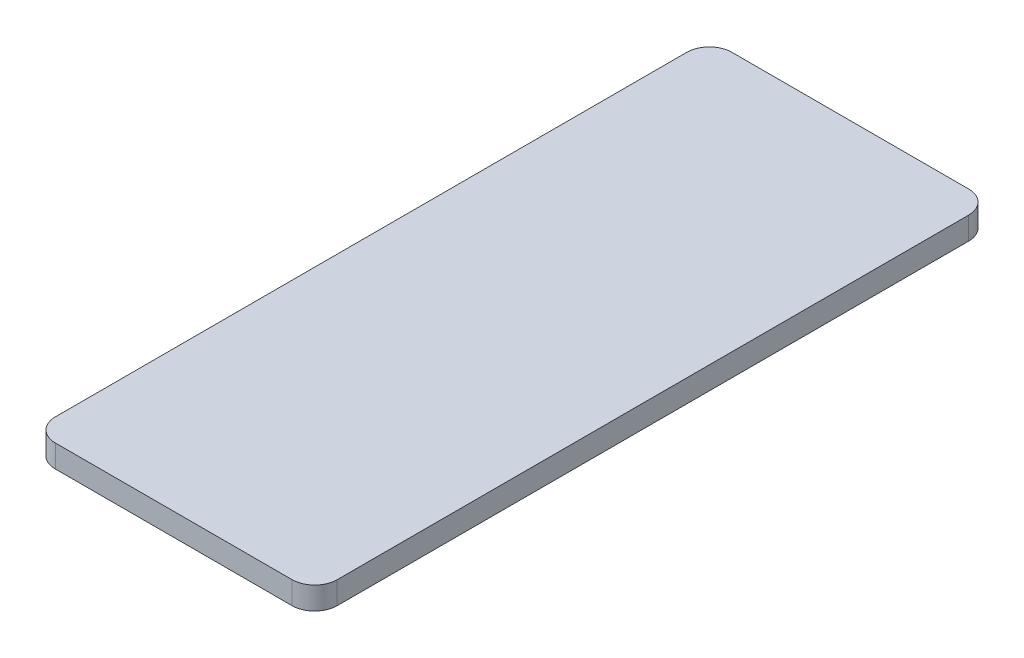
ISO-10303-21;
HEADER;
FILE_DESCRIPTION(('STEP AP214'),'2;1');
FILE_NAME('part.step','',(''),(''),'','','');
FILE_SCHEMA(('AUTOMOTIVE_DESIGN { 1 0 10303 214 1 1 1 1 }'));
ENDSEC;
DATA;
#1=APPLICATION_CONTEXT('core data for automotive mechanical design processes');
#2=APPLICATION_PROTOCOL_DEFINITION('international standard','automotive_design',2000,#1);
#3=PRODUCT_CONTEXT('',#1,'mechanical');
#4=PRODUCT('Part','Part','',(#3));
#5=PRODUCT_RELATED_PRODUCT_CATEGORY('part','',(#4));
#6=PRODUCT_DEFINITION_FORMATION('','',#4);
#7=PRODUCT_DEFINITION_CONTEXT('part definition',#1,'design');
#8=PRODUCT_DEFINITION('design','',#6,#7);
#9=PRODUCT_DEFINITION_SHAPE('','',#8);
#10=(LENGTH_UNIT() NAMED_UNIT(*) SI_UNIT(.MILLI.,.METRE.));
#11=(NAMED_UNIT(*) PLANE_ANGLE_UNIT() SI_UNIT($,.RADIAN.));
#12=(NAMED_UNIT(*) SI_UNIT($,.STERADIAN.) SOLID_ANGLE_UNIT());
#13=UNCERTAINTY_MEASURE_WITH_UNIT(LENGTH_MEASURE(1.E-05),#10,'distance_accuracy_value','');
#14=(GEOMETRIC_REPRESENTATION_CONTEXT(3) GLOBAL_UNCERTAINTY_ASSIGNED_CONTEXT((#13)) GLOBAL_UNIT_ASSIGNED_CONTEXT((#10,
#11,#12)) REPRESENTATION_CONTEXT('',''));
#15=CARTESIAN_POINT('',(0.,0.,0.));
#16=DIRECTION('',(0.,0.,1.));
#17=DIRECTION('',(1.,0.,0.));
#18=AXIS2_PLACEMENT_3D('',#15,#16,#17);
#19=CARTESIAN_POINT('',(-12.5,2.,30.));
#20=DIRECTION('',(1.,0.,0.));
#21=DIRECTION('',(0.,0.,-1.));
#22=AXIS2_PLACEMENT_3D('',#19,#20,#21);
#23=PLANE('',#22);
#24=DIRECTION('',(0.,0.,1.));
#25=VECTOR('',#24,1.);
#26=CARTESIAN_POINT('',(-12.5,0.,30.));
#27=LINE('',#26,#25);
#28=CARTESIAN_POINT('',(-12.5,0.,-28.));
#29=VERTEX_POINT('',#28);
#30=CARTESIAN_POINT('',(-12.5,0.,28.));
#31=VERTEX_POINT('',#30);
#32=EDGE_CURVE('E136',#29,#31,#27,.T.);
#33=ORIENTED_EDGE('',*,*,#32,.T.);
#34=DIRECTION('',(0.,-1.,0.));
#35=VECTOR('',#34,1.);
#36=CARTESIAN_POINT('',(-12.5,2.,28.));
#37=LINE('',#36,#35);
#38=CARTESIAN_POINT('',(-12.5,2.,28.));
#39=VERTEX_POINT('',#38);
#40=EDGE_CURVE('E111',#31,#39,#37,.F.);
#41=ORIENTED_EDGE('',*,*,#40,.T.);
#42=DIRECTION('',(0.,0.,1.));
#43=VECTOR('',#42,1.);
#44=CARTESIAN_POINT('',(-12.5,2.,30.));
#45=LINE('',#44,#43);
#46=CARTESIAN_POINT('',(-12.5,2.,-28.));
#47=VERTEX_POINT('',#46);
#48=EDGE_CURVE('E148',#47,#39,#45,.T.);
#49=ORIENTED_EDGE('',*,*,#48,.F.);
#50=DIRECTION('',(0.,-1.,0.));
#51=VECTOR('',#50,1.);
#52=CARTESIAN_POINT('',(-12.5,2.,-28.));
#53=LINE('',#52,#51);
#54=EDGE_CURVE('E117',#47,#29,#53,.T.);
#55=ORIENTED_EDGE('',*,*,#54,.T.);
#56=EDGE_LOOP('',(#33,#41,#49,#55));
#57=FACE_BOUND('',#56,.T.);
#58=ADVANCED_FACE('F39',(#57),#23,.F.);
#59=CARTESIAN_POINT('',(12.5,2.,30.));
#60=DIRECTION('',(0.,0.,-1.));
#61=DIRECTION('',(-1.,0.,0.));
#62=AXIS2_PLACEMENT_3D('',#59,#60,#61);
#63=PLANE('',#62);
#64=DIRECTION('',(1.,0.,0.));
#65=VECTOR('',#64,1.);
#66=CARTESIAN_POINT('',(12.5,2.,30.));
#67=LINE('',#66,#65);
#68=CARTESIAN_POINT('',(-10.5,2.,30.));
#69=VERTEX_POINT('',#68);
#70=CARTESIAN_POINT('',(10.5,2.,30.));
#71=VERTEX_POINT('',#70);
#72=EDGE_CURVE('E127',#69,#71,#67,.T.);
#73=ORIENTED_EDGE('',*,*,#72,.F.);
#74=DIRECTION('',(0.,-1.,0.));
#75=VECTOR('',#74,1.);
#76=CARTESIAN_POINT('',(-10.5,2.,30.));
#77=LINE('',#76,#75);
#78=CARTESIAN_POINT('',(-10.5,0.,30.));
#79=VERTEX_POINT('',#78);
#80=EDGE_CURVE('E110',#69,#79,#77,.T.);
#81=ORIENTED_EDGE('',*,*,#80,.T.);
#82=DIRECTION('',(1.,0.,0.));
#83=VECTOR('',#82,1.);
#84=CARTESIAN_POINT('',(12.5,0.,30.));
#85=LINE('',#84,#83);
#86=CARTESIAN_POINT('',(10.5,0.,30.));
#87=VERTEX_POINT('',#86);
#88=EDGE_CURVE('E124',#79,#87,#85,.T.);
#89=ORIENTED_EDGE('',*,*,#88,.T.);
#90=DIRECTION('',(0.,-1.,0.));
#91=VECTOR('',#90,1.);
#92=CARTESIAN_POINT('',(10.5,2.,30.));
#93=LINE('',#92,#91);
#94=EDGE_CURVE('E130',#87,#71,#93,.F.);
#95=ORIENTED_EDGE('',*,*,#94,.T.);
#96=EDGE_LOOP('',(#73,#81,#89,#95));
#97=FACE_BOUND('',#96,.T.);
#98=ADVANCED_FACE('F123',(#97),#63,.F.);
#99=CARTESIAN_POINT('',(12.5,2.,30.));
#100=DIRECTION('',(-1.,0.,0.));
#101=DIRECTION('',(0.,0.,1.));
#102=AXIS2_PLACEMENT_3D('',#99,#100,#101);
#103=PLANE('',#102);
#104=DIRECTION('',(0.,0.,-1.));
#105=VECTOR('',#104,1.);
#106=CARTESIAN_POINT('',(12.5,0.,30.));
#107=LINE('',#106,#105);
#108=CARTESIAN_POINT('',(12.5,0.,28.));
#109=VERTEX_POINT('',#108);
#110=CARTESIAN_POINT('',(12.5,0.,-28.));
#111=VERTEX_POINT('',#110);
#112=EDGE_CURVE('E135',#109,#111,#107,.T.);
#113=ORIENTED_EDGE('',*,*,#112,.T.);
#114=DIRECTION('',(0.,-1.,0.));
#115=VECTOR('',#114,1.);
#116=CARTESIAN_POINT('',(12.5,2.,-28.));
#117=LINE('',#116,#115);
#118=CARTESIAN_POINT('',(12.5,2.,-28.));
#119=VERTEX_POINT('',#118);
#120=EDGE_CURVE('E11',#111,#119,#117,.F.);
#121=ORIENTED_EDGE('',*,*,#120,.T.);
#122=DIRECTION('',(0.,0.,-1.));
#123=VECTOR('',#122,1.);
#124=CARTESIAN_POINT('',(12.5,2.,30.));
#125=LINE('',#124,#123);
#126=CARTESIAN_POINT('',(12.5,2.,28.));
#127=VERTEX_POINT('',#126);
#128=EDGE_CURVE('E187',#127,#119,#125,.T.);
#129=ORIENTED_EDGE('',*,*,#128,.F.);
#130=DIRECTION('',(0.,-1.,0.));
#131=VECTOR('',#130,1.);
#132=CARTESIAN_POINT('',(12.5,2.,28.));
#133=LINE('',#132,#131);
#134=EDGE_CURVE('E48',#127,#109,#133,.T.);
#135=ORIENTED_EDGE('',*,*,#134,.T.);
#136=EDGE_LOOP('',(#113,#121,#129,#135));
#137=FACE_BOUND('',#136,.T.);
#138=ADVANCED_FACE('F185',(#137),#103,.F.);
#139=CARTESIAN_POINT('',(12.5,2.,-30.));
#140=DIRECTION('',(0.,0.,1.));
#141=DIRECTION('',(1.,0.,0.));
#142=AXIS2_PLACEMENT_3D('',#139,#140,#141);
#143=PLANE('',#142);
#144=DIRECTION('',(-1.,0.,0.));
#145=VECTOR('',#144,1.);
#146=CARTESIAN_POINT('',(12.5,0.,-30.));
#147=LINE('',#146,#145);
#148=CARTESIAN_POINT('',(10.5,0.,-30.));
#149=VERTEX_POINT('',#148);
#150=CARTESIAN_POINT('',(-10.5,0.,-30.));
#151=VERTEX_POINT('',#150);
#152=EDGE_CURVE('E141',#149,#151,#147,.T.);
#153=ORIENTED_EDGE('',*,*,#152,.T.);
#154=DIRECTION('',(0.,-1.,0.));
#155=VECTOR('',#154,1.);
#156=CARTESIAN_POINT('',(-10.5,2.,-30.));
#157=LINE('',#156,#155);
#158=CARTESIAN_POINT('',(-10.5,2.,-30.));
#159=VERTEX_POINT('',#158);
#160=EDGE_CURVE('E55',#151,#159,#157,.F.);
#161=ORIENTED_EDGE('',*,*,#160,.T.);
#162=DIRECTION('',(-1.,0.,0.));
#163=VECTOR('',#162,1.);
#164=CARTESIAN_POINT('',(12.5,2.,-30.));
#165=LINE('',#164,#163);
#166=CARTESIAN_POINT('',(10.5,2.,-30.));
#167=VERTEX_POINT('',#166);
#168=EDGE_CURVE('E150',#167,#159,#165,.T.);
#169=ORIENTED_EDGE('',*,*,#168,.F.);
#170=DIRECTION('',(0.,-1.,0.));
#171=VECTOR('',#170,1.);
#172=CARTESIAN_POINT('',(10.5,2.,-30.));
#173=LINE('',#172,#171);
#174=EDGE_CURVE('E175',#167,#149,#173,.T.);
#175=ORIENTED_EDGE('',*,*,#174,.T.);
#176=EDGE_LOOP('',(#153,#161,#169,#175));
#177=FACE_BOUND('',#176,.T.);
#178=ADVANCED_FACE('F194',(#177),#143,.F.);
#179=CARTESIAN_POINT('',(0.,2.,0.));
#180=DIRECTION('',(0.,1.,0.));
#181=DIRECTION('',(0.,0.,1.));
#182=AXIS2_PLACEMENT_3D('',#179,#180,#181);
#183=PLANE('',#182);
#184=ORIENTED_EDGE('',*,*,#48,.T.);
#185=CARTESIAN_POINT('',(-10.5,2.,28.));
#186=DIRECTION('',(0.,1.,0.));
#187=DIRECTION('',(0.,0.,1.));
#188=AXIS2_PLACEMENT_3D('',#185,#186,#187);
#189=CIRCLE('',#188,2.);
#190=EDGE_CURVE('E172',#39,#69,#189,.T.);
#191=ORIENTED_EDGE('',*,*,#190,.T.);
#192=ORIENTED_EDGE('',*,*,#72,.T.);
#193=CARTESIAN_POINT('',(10.5,2.,28.));
#194=DIRECTION('',(0.,1.,0.));
#195=DIRECTION('',(0.,0.,1.));
#196=AXIS2_PLACEMENT_3D('',#193,#194,#195);
#197=CIRCLE('',#196,2.);
#198=EDGE_CURVE('E164',#71,#127,#197,.T.);
#199=ORIENTED_EDGE('',*,*,#198,.T.);
#200=ORIENTED_EDGE('',*,*,#128,.T.);
#201=CARTESIAN_POINT('',(10.5,2.,-28.));
#202=DIRECTION('',(0.,1.,0.));
#203=DIRECTION('',(0.,0.,1.));
#204=AXIS2_PLACEMENT_3D('',#201,#202,#203);
#205=CIRCLE('',#204,2.);
#206=EDGE_CURVE('E62',#119,#167,#205,.T.);
#207=ORIENTED_EDGE('',*,*,#206,.T.);
#208=ORIENTED_EDGE('',*,*,#168,.T.);
#209=CARTESIAN_POINT('',(-10.5,2.,-28.));
#210=DIRECTION('',(0.,1.,0.));
#211=DIRECTION('',(0.,0.,1.));
#212=AXIS2_PLACEMENT_3D('',#209,#210,#211);
#213=CIRCLE('',#212,2.);
#214=EDGE_CURVE('E169',#159,#47,#213,.T.);
#215=ORIENTED_EDGE('',*,*,#214,.T.);
#216=EDGE_LOOP('',(#184,#191,#192,#199,#200,#207,#208,#215));
#217=FACE_BOUND('',#216,.T.);
#218=ADVANCED_FACE('F205',(#217),#183,.T.);
#219=CARTESIAN_POINT('',(0.,0.,0.));
#220=DIRECTION('',(0.,1.,0.));
#221=DIRECTION('',(0.,0.,1.));
#222=AXIS2_PLACEMENT_3D('',#219,#220,#221);
#223=PLANE('',#222);
#224=ORIENTED_EDGE('',*,*,#88,.F.);
#225=CARTESIAN_POINT('',(-10.5,0.,28.));
#226=DIRECTION('',(0.,1.,0.));
#227=DIRECTION('',(0.,0.,1.));
#228=AXIS2_PLACEMENT_3D('',#225,#226,#227);
#229=CIRCLE('',#228,2.);
#230=EDGE_CURVE('E106',#79,#31,#229,.F.);
#231=ORIENTED_EDGE('',*,*,#230,.T.);
#232=ORIENTED_EDGE('',*,*,#32,.F.);
#233=CARTESIAN_POINT('',(-10.5,0.,-28.));
#234=DIRECTION('',(0.,1.,0.));
#235=DIRECTION('',(0.,0.,1.));
#236=AXIS2_PLACEMENT_3D('',#233,#234,#235);
#237=CIRCLE('',#236,2.);
#238=EDGE_CURVE('E118',#29,#151,#237,.F.);
#239=ORIENTED_EDGE('',*,*,#238,.T.);
#240=ORIENTED_EDGE('',*,*,#152,.F.);
#241=CARTESIAN_POINT('',(10.5,0.,-28.));
#242=DIRECTION('',(0.,1.,0.));
#243=DIRECTION('',(0.,0.,1.));
#244=AXIS2_PLACEMENT_3D('',#241,#242,#243);
#245=CIRCLE('',#244,2.);
#246=EDGE_CURVE('E154',#149,#111,#245,.F.);
#247=ORIENTED_EDGE('',*,*,#246,.T.);
#248=ORIENTED_EDGE('',*,*,#112,.F.);
#249=CARTESIAN_POINT('',(10.5,0.,28.));
#250=DIRECTION('',(0.,1.,0.));
#251=DIRECTION('',(0.,0.,1.));
#252=AXIS2_PLACEMENT_3D('',#249,#250,#251);
#253=CIRCLE('',#252,2.);
#254=EDGE_CURVE('E129',#109,#87,#253,.F.);
#255=ORIENTED_EDGE('',*,*,#254,.T.);
#256=EDGE_LOOP('',(#224,#231,#232,#239,#240,#247,#248,#255));
#257=FACE_BOUND('',#256,.T.);
#258=ADVANCED_FACE('F132',(#257),#223,.F.);
#259=CARTESIAN_POINT('',(-10.5,2.,28.));
#260=DIRECTION('',(0.,-1.,0.));
#261=DIRECTION('',(0.,0.,-1.));
#262=AXIS2_PLACEMENT_3D('',#259,#260,#261);
#263=CYLINDRICAL_SURFACE('',#262,2.);
#264=ORIENTED_EDGE('',*,*,#190,.F.);
#265=ORIENTED_EDGE('',*,*,#40,.F.);
#266=ORIENTED_EDGE('',*,*,#230,.F.);
#267=ORIENTED_EDGE('',*,*,#80,.F.);
#268=EDGE_LOOP('',(#264,#265,#266,#267));
#269=FACE_BOUND('',#268,.T.);
#270=ADVANCED_FACE('F109',(#269),#263,.T.);
#271=CARTESIAN_POINT('',(-10.5,2.,-28.));
#272=DIRECTION('',(0.,-1.,0.));
#273=DIRECTION('',(0.,0.,-1.));
#274=AXIS2_PLACEMENT_3D('',#271,#272,#273);
#275=CYLINDRICAL_SURFACE('',#274,2.);
#276=ORIENTED_EDGE('',*,*,#214,.F.);
#277=ORIENTED_EDGE('',*,*,#160,.F.);
#278=ORIENTED_EDGE('',*,*,#238,.F.);
#279=ORIENTED_EDGE('',*,*,#54,.F.);
#280=EDGE_LOOP('',(#276,#277,#278,#279));
#281=FACE_BOUND('',#280,.T.);
#282=ADVANCED_FACE('F209',(#281),#275,.T.);
#283=CARTESIAN_POINT('',(10.5,2.,-28.));
#284=DIRECTION('',(0.,-1.,0.));
#285=DIRECTION('',(0.,0.,-1.));
#286=AXIS2_PLACEMENT_3D('',#283,#284,#285);
#287=CYLINDRICAL_SURFACE('',#286,2.);
#288=ORIENTED_EDGE('',*,*,#206,.F.);
#289=ORIENTED_EDGE('',*,*,#120,.F.);
#290=ORIENTED_EDGE('',*,*,#246,.F.);
#291=ORIENTED_EDGE('',*,*,#174,.F.);
#292=EDGE_LOOP('',(#288,#289,#290,#291));
#293=FACE_BOUND('',#292,.T.);
#294=ADVANCED_FACE('F193',(#293),#287,.T.);
#295=CARTESIAN_POINT('',(10.5,2.,28.));
#296=DIRECTION('',(0.,-1.,0.));
#297=DIRECTION('',(0.,0.,-1.));
#298=AXIS2_PLACEMENT_3D('',#295,#296,#297);
#299=CYLINDRICAL_SURFACE('',#298,2.);
#300=ORIENTED_EDGE('',*,*,#198,.F.);
#301=ORIENTED_EDGE('',*,*,#94,.F.);
#302=ORIENTED_EDGE('',*,*,#254,.F.);
#303=ORIENTED_EDGE('',*,*,#134,.F.);
#304=EDGE_LOOP('',(#300,#301,#302,#303));
#305=FACE_BOUND('',#304,.T.);
#306=ADVANCED_FACE('F41',(#305),#299,.T.);
#307=CLOSED_SHELL('',(#58,#98,#138,#178,#218,#258,#270,#282,#294,#306));
#308=MANIFOLD_SOLID_BREP('B2',#307);
#309=ADVANCED_BREP_SHAPE_REPRESENTATION('',(#18,#308),#14);
#310=SHAPE_DEFINITION_REPRESENTATION(#9,#309);
ENDSEC;
END-ISO-10303-21;
